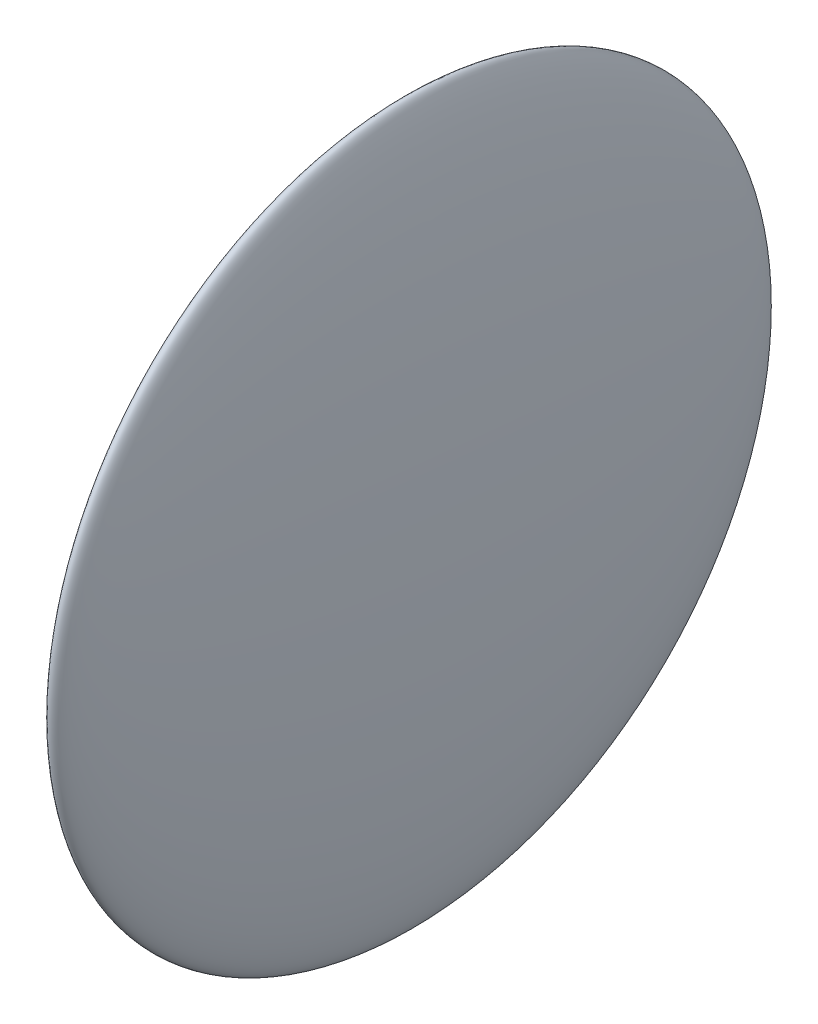
ISO-10303-21;
HEADER;
FILE_DESCRIPTION(('STEP AP214'),'2;1');
FILE_NAME('part.step','',(''),(''),'','','');
FILE_SCHEMA(('AUTOMOTIVE_DESIGN { 1 0 10303 214 1 1 1 1 }'));
ENDSEC;
DATA;
#1=APPLICATION_CONTEXT('core data for automotive mechanical design processes');
#2=APPLICATION_PROTOCOL_DEFINITION('international standard','automotive_design',2000,#1);
#3=PRODUCT_CONTEXT('',#1,'mechanical');
#4=PRODUCT('Part','Part','',(#3));
#5=PRODUCT_RELATED_PRODUCT_CATEGORY('part','',(#4));
#6=PRODUCT_DEFINITION_FORMATION('','',#4);
#7=PRODUCT_DEFINITION_CONTEXT('part definition',#1,'design');
#8=PRODUCT_DEFINITION('design','',#6,#7);
#9=PRODUCT_DEFINITION_SHAPE('','',#8);
#10=(LENGTH_UNIT() NAMED_UNIT(*) SI_UNIT(.MILLI.,.METRE.));
#11=(NAMED_UNIT(*) PLANE_ANGLE_UNIT() SI_UNIT($,.RADIAN.));
#12=(NAMED_UNIT(*) SI_UNIT($,.STERADIAN.) SOLID_ANGLE_UNIT());
#13=UNCERTAINTY_MEASURE_WITH_UNIT(LENGTH_MEASURE(1.E-05),#10,'distance_accuracy_value','');
#14=(GEOMETRIC_REPRESENTATION_CONTEXT(3) GLOBAL_UNCERTAINTY_ASSIGNED_CONTEXT((#13)) GLOBAL_UNIT_ASSIGNED_CONTEXT((#10,
#11,#12)) REPRESENTATION_CONTEXT('',''));
#15=CARTESIAN_POINT('',(0.,0.,0.));
#16=DIRECTION('',(0.,0.,1.));
#17=DIRECTION('',(1.,0.,0.));
#18=AXIS2_PLACEMENT_3D('',#15,#16,#17);
#19=CARTESIAN_POINT('',(0.,3.75,0.));
#20=DIRECTION('',(0.,0.,1.));
#21=DIRECTION('',(0.,-1.,0.));
#22=AXIS2_PLACEMENT_3D('',#19,#20,#21);
#23=ELLIPSE('',#22,3.75,0.35);
#24=TRIMMED_CURVE('',#23,(PARAMETER_VALUE(1.5707963267949)),(PARAMETER_VALUE(4.71238898038469)),
.T.,.PARAMETER.);
#25=CARTESIAN_POINT('',(-1.70196653623149,3.75,0.));
#26=DIRECTION('',(-1.,0.,0.));
#27=AXIS1_PLACEMENT('',#25,#26);
#28=SURFACE_OF_REVOLUTION('',#24,#27);
#29=CARTESIAN_POINT('',(-0.35,3.75,0.));
#30=VERTEX_POINT('',#29);
#31=VERTEX_LOOP('',#30);
#32=FACE_BOUND('',#31,.T.);
#33=CARTESIAN_POINT('',(0.350000000000001,3.75,0.));
#34=VERTEX_POINT('',#33);
#35=VERTEX_LOOP('',#34);
#36=FACE_BOUND('',#35,.T.);
#37=ADVANCED_FACE('F37',(#32,#36),#28,.T.);
#38=CLOSED_SHELL('',(#37));
#39=MANIFOLD_SOLID_BREP('B2',#38);
#40=ADVANCED_BREP_SHAPE_REPRESENTATION('',(#18,#39),#14);
#41=SHAPE_DEFINITION_REPRESENTATION(#9,#40);
ENDSEC;
END-ISO-10303-21;
